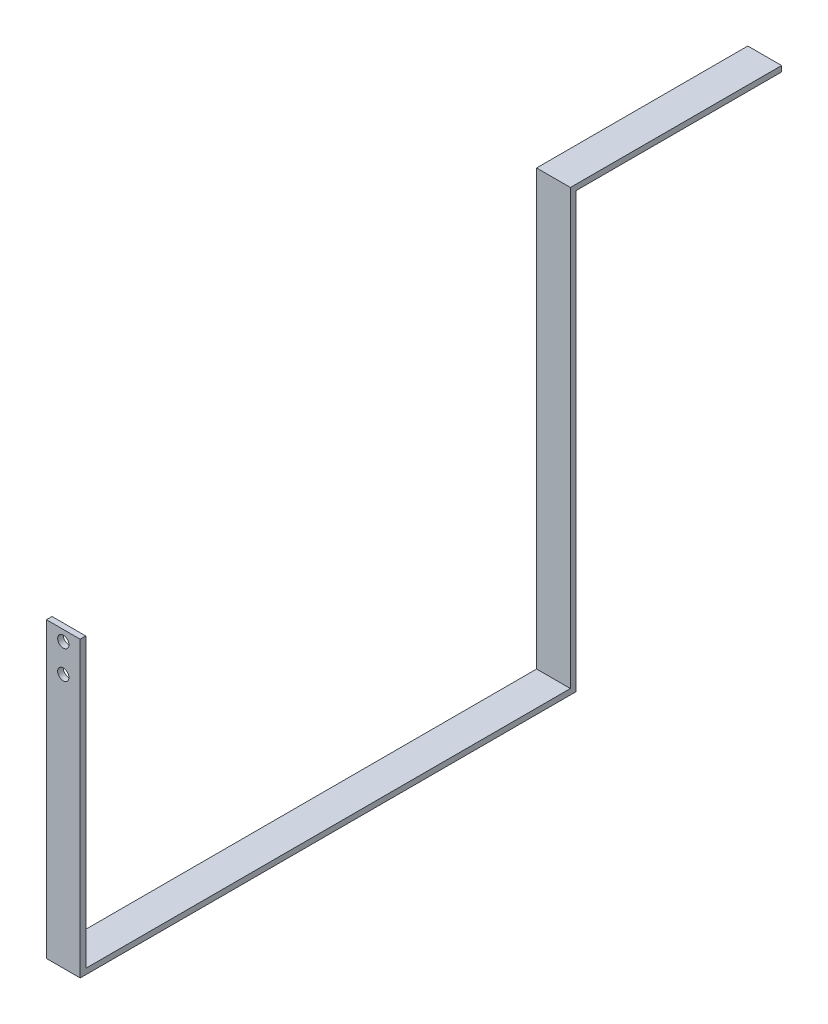
ISO-10303-21;
HEADER;
FILE_DESCRIPTION(('STEP AP214'),'2;1');
FILE_NAME('part.step','',(''),(''),'','','');
FILE_SCHEMA(('AUTOMOTIVE_DESIGN { 1 0 10303 214 1 1 1 1 }'));
ENDSEC;
DATA;
#1=APPLICATION_CONTEXT('core data for automotive mechanical design processes');
#2=APPLICATION_PROTOCOL_DEFINITION('international standard','automotive_design',2000,#1);
#3=PRODUCT_CONTEXT('',#1,'mechanical');
#4=PRODUCT('Part','Part','',(#3));
#5=PRODUCT_RELATED_PRODUCT_CATEGORY('part','',(#4));
#6=PRODUCT_DEFINITION_FORMATION('','',#4);
#7=PRODUCT_DEFINITION_CONTEXT('part definition',#1,'design');
#8=PRODUCT_DEFINITION('design','',#6,#7);
#9=PRODUCT_DEFINITION_SHAPE('','',#8);
#10=(LENGTH_UNIT() NAMED_UNIT(*) SI_UNIT(.MILLI.,.METRE.));
#11=(NAMED_UNIT(*) PLANE_ANGLE_UNIT() SI_UNIT($,.RADIAN.));
#12=(NAMED_UNIT(*) SI_UNIT($,.STERADIAN.) SOLID_ANGLE_UNIT());
#13=UNCERTAINTY_MEASURE_WITH_UNIT(LENGTH_MEASURE(1.E-05),#10,'distance_accuracy_value','');
#14=(GEOMETRIC_REPRESENTATION_CONTEXT(3) GLOBAL_UNCERTAINTY_ASSIGNED_CONTEXT((#13)) GLOBAL_UNIT_ASSIGNED_CONTEXT((#10,
#11,#12)) REPRESENTATION_CONTEXT('',''));
#15=CARTESIAN_POINT('',(0.,0.,0.));
#16=DIRECTION('',(0.,0.,1.));
#17=DIRECTION('',(1.,0.,0.));
#18=AXIS2_PLACEMENT_3D('',#15,#16,#17);
#19=CARTESIAN_POINT('',(19.05,-485.945,790.56));
#20=DIRECTION('',(0.,-1.,0.));
#21=DIRECTION('',(1.,0.,0.));
#22=AXIS2_PLACEMENT_3D('',#19,#20,#21);
#23=PLANE('',#22);
#24=DIRECTION('',(-1.,0.,0.));
#25=VECTOR('',#24,1.);
#26=CARTESIAN_POINT('',(-19.05,-485.945,784.25));
#27=LINE('',#26,#25);
#28=CARTESIAN_POINT('',(19.05,-485.945,784.25));
#29=VERTEX_POINT('',#28);
#30=CARTESIAN_POINT('',(-19.05,-485.945,784.25));
#31=VERTEX_POINT('',#30);
#32=EDGE_CURVE('E134',#29,#31,#27,.T.);
#33=ORIENTED_EDGE('',*,*,#32,.F.);
#34=DIRECTION('',(0.,0.,-1.));
#35=VECTOR('',#34,1.);
#36=CARTESIAN_POINT('',(19.05,-485.945,790.56));
#37=LINE('',#36,#35);
#38=CARTESIAN_POINT('',(19.05,-485.945,238.06));
#39=VERTEX_POINT('',#38);
#40=EDGE_CURVE('E51',#29,#39,#37,.T.);
#41=ORIENTED_EDGE('',*,*,#40,.T.);
#42=DIRECTION('',(-1.,0.,0.));
#43=VECTOR('',#42,1.);
#44=CARTESIAN_POINT('',(19.05,-485.945,238.06));
#45=LINE('',#44,#43);
#46=CARTESIAN_POINT('',(-19.05,-485.945,238.06));
#47=VERTEX_POINT('',#46);
#48=EDGE_CURVE('E138',#39,#47,#45,.T.);
#49=ORIENTED_EDGE('',*,*,#48,.T.);
#50=DIRECTION('',(0.,0.,-1.));
#51=VECTOR('',#50,1.);
#52=CARTESIAN_POINT('',(-19.05,-485.945,790.56));
#53=LINE('',#52,#51);
#54=EDGE_CURVE('E151',#31,#47,#53,.T.);
#55=ORIENTED_EDGE('',*,*,#54,.F.);
#56=EDGE_LOOP('',(#33,#41,#49,#55));
#57=FACE_BOUND('',#56,.T.);
#58=ADVANCED_FACE('F36',(#57),#23,.F.);
#59=CARTESIAN_POINT('',(0.,0.,238.06));
#60=DIRECTION('',(0.,0.,-1.));
#61=DIRECTION('',(-1.,0.,0.));
#62=AXIS2_PLACEMENT_3D('',#59,#60,#61);
#63=PLANE('',#62);
#64=ORIENTED_EDGE('',*,*,#48,.F.);
#65=DIRECTION('',(0.,1.,0.));
#66=VECTOR('',#65,1.);
#67=CARTESIAN_POINT('',(19.05,-3.155,238.06));
#68=LINE('',#67,#66);
#69=CARTESIAN_POINT('',(19.05,3.155,238.06));
#70=VERTEX_POINT('',#69);
#71=EDGE_CURVE('E169',#39,#70,#68,.T.);
#72=ORIENTED_EDGE('',*,*,#71,.T.);
#73=DIRECTION('',(-1.,0.,0.));
#74=VECTOR('',#73,1.);
#75=CARTESIAN_POINT('',(-19.05,3.155,238.06));
#76=LINE('',#75,#74);
#77=CARTESIAN_POINT('',(-19.05,3.155,238.06));
#78=VERTEX_POINT('',#77);
#79=EDGE_CURVE('E171',#70,#78,#76,.T.);
#80=ORIENTED_EDGE('',*,*,#79,.T.);
#81=DIRECTION('',(0.,-1.,0.));
#82=VECTOR('',#81,1.);
#83=CARTESIAN_POINT('',(-19.05,-3.155,238.06));
#84=LINE('',#83,#82);
#85=EDGE_CURVE('E174',#78,#47,#84,.T.);
#86=ORIENTED_EDGE('',*,*,#85,.T.);
#87=EDGE_LOOP('',(#64,#72,#80,#86));
#88=FACE_BOUND('',#87,.T.);
#89=ADVANCED_FACE('F251',(#88),#63,.F.);
#90=CARTESIAN_POINT('',(-19.05,-3.155,238.06));
#91=DIRECTION('',(0.,1.,0.));
#92=DIRECTION('',(0.,0.,1.));
#93=AXIS2_PLACEMENT_3D('',#90,#91,#92);
#94=PLANE('',#93);
#95=DIRECTION('',(1.,0.,0.));
#96=VECTOR('',#95,1.);
#97=CARTESIAN_POINT('',(-19.05,-3.155,231.75));
#98=LINE('',#97,#96);
#99=CARTESIAN_POINT('',(-19.05,-3.155,231.75));
#100=VERTEX_POINT('',#99);
#101=CARTESIAN_POINT('',(19.05,-3.155,231.75));
#102=VERTEX_POINT('',#101);
#103=EDGE_CURVE('E59',#100,#102,#98,.T.);
#104=ORIENTED_EDGE('',*,*,#103,.F.);
#105=DIRECTION('',(0.,0.,-1.));
#106=VECTOR('',#105,1.);
#107=CARTESIAN_POINT('',(-19.05,-3.155,238.06));
#108=LINE('',#107,#106);
#109=CARTESIAN_POINT('',(-19.05,-3.155,0.));
#110=VERTEX_POINT('',#109);
#111=EDGE_CURVE('E187',#100,#110,#108,.T.);
#112=ORIENTED_EDGE('',*,*,#111,.T.);
#113=DIRECTION('',(1.,0.,0.));
#114=VECTOR('',#113,1.);
#115=CARTESIAN_POINT('',(-19.05,-3.155,0.));
#116=LINE('',#115,#114);
#117=CARTESIAN_POINT('',(19.05,-3.155,0.));
#118=VERTEX_POINT('',#117);
#119=EDGE_CURVE('E172',#110,#118,#116,.T.);
#120=ORIENTED_EDGE('',*,*,#119,.T.);
#121=DIRECTION('',(0.,0.,-1.));
#122=VECTOR('',#121,1.);
#123=CARTESIAN_POINT('',(19.05,-3.155,238.06));
#124=LINE('',#123,#122);
#125=EDGE_CURVE('E177',#102,#118,#124,.T.);
#126=ORIENTED_EDGE('',*,*,#125,.F.);
#127=EDGE_LOOP('',(#104,#112,#120,#126));
#128=FACE_BOUND('',#127,.T.);
#129=ADVANCED_FACE('F200',(#128),#94,.F.);
#130=CARTESIAN_POINT('',(19.05,-3.155,238.06));
#131=DIRECTION('',(-1.,0.,0.));
#132=DIRECTION('',(0.,0.,1.));
#133=AXIS2_PLACEMENT_3D('',#130,#131,#132);
#134=PLANE('',#133);
#135=DIRECTION('',(0.,1.,0.));
#136=VECTOR('',#135,1.);
#137=CARTESIAN_POINT('',(19.05,-3.155,0.));
#138=LINE('',#137,#136);
#139=CARTESIAN_POINT('',(19.05,3.155,0.));
#140=VERTEX_POINT('',#139);
#141=EDGE_CURVE('E168',#118,#140,#138,.T.);
#142=ORIENTED_EDGE('',*,*,#141,.T.);
#143=DIRECTION('',(0.,0.,-1.));
#144=VECTOR('',#143,1.);
#145=CARTESIAN_POINT('',(19.05,3.155,238.06));
#146=LINE('',#145,#144);
#147=EDGE_CURVE('E11',#70,#140,#146,.T.);
#148=ORIENTED_EDGE('',*,*,#147,.F.);
#149=ORIENTED_EDGE('',*,*,#71,.F.);
#150=ORIENTED_EDGE('',*,*,#40,.F.);
#151=DIRECTION('',(0.,-1.,0.));
#152=VECTOR('',#151,1.);
#153=CARTESIAN_POINT('',(19.05,-161.555,784.25));
#154=LINE('',#153,#152);
#155=CARTESIAN_POINT('',(19.05,-161.555,784.25));
#156=VERTEX_POINT('',#155);
#157=EDGE_CURVE('E118',#156,#29,#154,.T.);
#158=ORIENTED_EDGE('',*,*,#157,.F.);
#159=DIRECTION('',(0.,0.,-1.));
#160=VECTOR('',#159,1.);
#161=CARTESIAN_POINT('',(19.05,-161.555,784.25));
#162=LINE('',#161,#160);
#163=CARTESIAN_POINT('',(19.05,-161.555,790.56));
#164=VERTEX_POINT('',#163);
#165=EDGE_CURVE('E125',#164,#156,#162,.T.);
#166=ORIENTED_EDGE('',*,*,#165,.F.);
#167=DIRECTION('',(0.,1.,0.));
#168=VECTOR('',#167,1.);
#169=CARTESIAN_POINT('',(19.05,-492.255,790.56));
#170=LINE('',#169,#168);
#171=CARTESIAN_POINT('',(19.05,-492.255,790.56));
#172=VERTEX_POINT('',#171);
#173=EDGE_CURVE('E150',#172,#164,#170,.T.);
#174=ORIENTED_EDGE('',*,*,#173,.F.);
#175=DIRECTION('',(0.,0.,1.));
#176=VECTOR('',#175,1.);
#177=CARTESIAN_POINT('',(19.05,-492.255,231.75));
#178=LINE('',#177,#176);
#179=CARTESIAN_POINT('',(19.05,-492.255,231.75));
#180=VERTEX_POINT('',#179);
#181=EDGE_CURVE('E155',#180,#172,#178,.T.);
#182=ORIENTED_EDGE('',*,*,#181,.F.);
#183=DIRECTION('',(0.,1.,0.));
#184=VECTOR('',#183,1.);
#185=CARTESIAN_POINT('',(19.05,-492.255,231.75));
#186=LINE('',#185,#184);
#187=EDGE_CURVE('E161',#180,#102,#186,.T.);
#188=ORIENTED_EDGE('',*,*,#187,.T.);
#189=ORIENTED_EDGE('',*,*,#125,.T.);
#190=EDGE_LOOP('',(#142,#148,#149,#150,#158,#166,#174,#182,#188,#189));
#191=FACE_BOUND('',#190,.T.);
#192=ADVANCED_FACE('F38',(#191),#134,.F.);
#193=CARTESIAN_POINT('',(-19.05,3.155,238.06));
#194=DIRECTION('',(0.,-1.,0.));
#195=DIRECTION('',(0.,0.,-1.));
#196=AXIS2_PLACEMENT_3D('',#193,#194,#195);
#197=PLANE('',#196);
#198=DIRECTION('',(-1.,0.,0.));
#199=VECTOR('',#198,1.);
#200=CARTESIAN_POINT('',(-19.05,3.155,0.));
#201=LINE('',#200,#199);
#202=CARTESIAN_POINT('',(-19.05,3.155,0.));
#203=VERTEX_POINT('',#202);
#204=EDGE_CURVE('E179',#140,#203,#201,.T.);
#205=ORIENTED_EDGE('',*,*,#204,.T.);
#206=DIRECTION('',(0.,0.,-1.));
#207=VECTOR('',#206,1.);
#208=CARTESIAN_POINT('',(-19.05,3.155,238.06));
#209=LINE('',#208,#207);
#210=EDGE_CURVE('E44',#78,#203,#209,.T.);
#211=ORIENTED_EDGE('',*,*,#210,.F.);
#212=ORIENTED_EDGE('',*,*,#79,.F.);
#213=ORIENTED_EDGE('',*,*,#147,.T.);
#214=EDGE_LOOP('',(#205,#211,#212,#213));
#215=FACE_BOUND('',#214,.T.);
#216=ADVANCED_FACE('F269',(#215),#197,.F.);
#217=CARTESIAN_POINT('',(-19.05,-3.155,238.06));
#218=DIRECTION('',(1.,0.,0.));
#219=DIRECTION('',(0.,0.,-1.));
#220=AXIS2_PLACEMENT_3D('',#217,#218,#219);
#221=PLANE('',#220);
#222=DIRECTION('',(0.,-1.,0.));
#223=VECTOR('',#222,1.);
#224=CARTESIAN_POINT('',(-19.05,-3.155,0.));
#225=LINE('',#224,#223);
#226=EDGE_CURVE('E181',#203,#110,#225,.T.);
#227=ORIENTED_EDGE('',*,*,#226,.T.);
#228=ORIENTED_EDGE('',*,*,#111,.F.);
#229=DIRECTION('',(0.,1.,0.));
#230=VECTOR('',#229,1.);
#231=CARTESIAN_POINT('',(-19.05,-492.255,231.75));
#232=LINE('',#231,#230);
#233=CARTESIAN_POINT('',(-19.05,-492.255,231.75));
#234=VERTEX_POINT('',#233);
#235=EDGE_CURVE('E165',#234,#100,#232,.T.);
#236=ORIENTED_EDGE('',*,*,#235,.F.);
#237=DIRECTION('',(0.,0.,-1.));
#238=VECTOR('',#237,1.);
#239=CARTESIAN_POINT('',(-19.05,-492.255,238.06));
#240=LINE('',#239,#238);
#241=CARTESIAN_POINT('',(-19.05,-492.255,790.56));
#242=VERTEX_POINT('',#241);
#243=EDGE_CURVE('E157',#242,#234,#240,.T.);
#244=ORIENTED_EDGE('',*,*,#243,.F.);
#245=DIRECTION('',(0.,-1.,0.));
#246=VECTOR('',#245,1.);
#247=CARTESIAN_POINT('',(-19.05,-485.945,790.56));
#248=LINE('',#247,#246);
#249=CARTESIAN_POINT('',(-19.05,-161.555,790.56));
#250=VERTEX_POINT('',#249);
#251=EDGE_CURVE('E140',#250,#242,#248,.T.);
#252=ORIENTED_EDGE('',*,*,#251,.F.);
#253=DIRECTION('',(0.,0.,1.));
#254=VECTOR('',#253,1.);
#255=CARTESIAN_POINT('',(-19.05,-161.555,790.56));
#256=LINE('',#255,#254);
#257=CARTESIAN_POINT('',(-19.05,-161.555,784.25));
#258=VERTEX_POINT('',#257);
#259=EDGE_CURVE('E124',#258,#250,#256,.T.);
#260=ORIENTED_EDGE('',*,*,#259,.F.);
#261=DIRECTION('',(0.,-1.,0.));
#262=VECTOR('',#261,1.);
#263=CARTESIAN_POINT('',(-19.05,-161.555,784.25));
#264=LINE('',#263,#262);
#265=EDGE_CURVE('E120',#258,#31,#264,.T.);
#266=ORIENTED_EDGE('',*,*,#265,.T.);
#267=ORIENTED_EDGE('',*,*,#54,.T.);
#268=ORIENTED_EDGE('',*,*,#85,.F.);
#269=ORIENTED_EDGE('',*,*,#210,.T.);
#270=EDGE_LOOP('',(#227,#228,#236,#244,#252,#260,#266,#267,#268,#269));
#271=FACE_BOUND('',#270,.T.);
#272=ADVANCED_FACE('F193',(#271),#221,.F.);
#273=CARTESIAN_POINT('',(0.,0.,0.));
#274=DIRECTION('',(0.,0.,-1.));
#275=DIRECTION('',(-1.,0.,0.));
#276=AXIS2_PLACEMENT_3D('',#273,#274,#275);
#277=PLANE('',#276);
#278=ORIENTED_EDGE('',*,*,#141,.F.);
#279=ORIENTED_EDGE('',*,*,#119,.F.);
#280=ORIENTED_EDGE('',*,*,#226,.F.);
#281=ORIENTED_EDGE('',*,*,#204,.F.);
#282=EDGE_LOOP('',(#278,#279,#280,#281));
#283=FACE_BOUND('',#282,.T.);
#284=ADVANCED_FACE('F199',(#283),#277,.T.);
#285=CARTESIAN_POINT('',(-19.05,-492.255,231.75));
#286=DIRECTION('',(0.,0.,1.));
#287=DIRECTION('',(1.,0.,0.));
#288=AXIS2_PLACEMENT_3D('',#285,#286,#287);
#289=PLANE('',#288);
#290=ORIENTED_EDGE('',*,*,#103,.T.);
#291=ORIENTED_EDGE('',*,*,#187,.F.);
#292=DIRECTION('',(1.,0.,0.));
#293=VECTOR('',#292,1.);
#294=CARTESIAN_POINT('',(-19.05,-492.255,231.75));
#295=LINE('',#294,#293);
#296=EDGE_CURVE('E159',#234,#180,#295,.T.);
#297=ORIENTED_EDGE('',*,*,#296,.F.);
#298=ORIENTED_EDGE('',*,*,#235,.T.);
#299=EDGE_LOOP('',(#290,#291,#297,#298));
#300=FACE_BOUND('',#299,.T.);
#301=ADVANCED_FACE('F204',(#300),#289,.F.);
#302=CARTESIAN_POINT('',(0.,-492.255,0.));
#303=DIRECTION('',(0.,-1.,0.));
#304=DIRECTION('',(0.,0.,-1.));
#305=AXIS2_PLACEMENT_3D('',#302,#303,#304);
#306=PLANE('',#305);
#307=ORIENTED_EDGE('',*,*,#181,.T.);
#308=DIRECTION('',(1.,0.,0.));
#309=VECTOR('',#308,1.);
#310=CARTESIAN_POINT('',(-19.05,-492.255,790.56));
#311=LINE('',#310,#309);
#312=EDGE_CURVE('E147',#242,#172,#311,.T.);
#313=ORIENTED_EDGE('',*,*,#312,.F.);
#314=ORIENTED_EDGE('',*,*,#243,.T.);
#315=ORIENTED_EDGE('',*,*,#296,.T.);
#316=EDGE_LOOP('',(#307,#313,#314,#315));
#317=FACE_BOUND('',#316,.T.);
#318=ADVANCED_FACE('F208',(#317),#306,.T.);
#319=CARTESIAN_POINT('',(0.,0.,790.56));
#320=DIRECTION('',(0.,0.,1.));
#321=DIRECTION('',(1.,0.,0.));
#322=AXIS2_PLACEMENT_3D('',#319,#320,#321);
#323=PLANE('',#322);
#324=CARTESIAN_POINT('',(-1.94289029309402E-13,-205.447204665716,790.56));
#325=DIRECTION('',(0.,0.,1.));
#326=DIRECTION('',(1.,0.,0.));
#327=AXIS2_PLACEMENT_3D('',#324,#325,#326);
#328=CIRCLE('',#327,6.34999999999994);
#329=CARTESIAN_POINT('',(6.34999999999975,-205.447204665716,790.56));
#330=VERTEX_POINT('',#329);
#331=EDGE_CURVE('E224',#330,#330,#328,.T.);
#332=ORIENTED_EDGE('',*,*,#331,.F.);
#333=EDGE_LOOP('',(#332));
#334=FACE_BOUND('',#333,.T.);
#335=CARTESIAN_POINT('',(0.,-173.447204665716,790.56));
#336=DIRECTION('',(0.,0.,1.));
#337=DIRECTION('',(1.,0.,0.));
#338=AXIS2_PLACEMENT_3D('',#335,#336,#337);
#339=CIRCLE('',#338,6.34999999999999);
#340=CARTESIAN_POINT('',(6.34999999999991,-173.447204665716,790.56));
#341=VERTEX_POINT('',#340);
#342=EDGE_CURVE('E216',#341,#341,#339,.T.);
#343=ORIENTED_EDGE('',*,*,#342,.F.);
#344=EDGE_LOOP('',(#343));
#345=FACE_BOUND('',#344,.T.);
#346=ORIENTED_EDGE('',*,*,#251,.T.);
#347=ORIENTED_EDGE('',*,*,#312,.T.);
#348=ORIENTED_EDGE('',*,*,#173,.T.);
#349=DIRECTION('',(1.,0.,0.));
#350=VECTOR('',#349,1.);
#351=CARTESIAN_POINT('',(19.05,-161.555,790.56));
#352=LINE('',#351,#350);
#353=EDGE_CURVE('E131',#250,#164,#352,.T.);
#354=ORIENTED_EDGE('',*,*,#353,.F.);
#355=EDGE_LOOP('',(#346,#347,#348,#354));
#356=FACE_BOUND('',#355,.T.);
#357=ADVANCED_FACE('F212',(#334,#345,#356),#323,.T.);
#358=CARTESIAN_POINT('',(-19.05,-161.555,784.25));
#359=DIRECTION('',(0.,0.,1.));
#360=DIRECTION('',(1.,0.,0.));
#361=AXIS2_PLACEMENT_3D('',#358,#359,#360);
#362=PLANE('',#361);
#363=CARTESIAN_POINT('',(-1.94289029309402E-13,-205.447204665716,784.25));
#364=DIRECTION('',(0.,0.,1.));
#365=DIRECTION('',(1.,0.,0.));
#366=AXIS2_PLACEMENT_3D('',#363,#364,#365);
#367=CIRCLE('',#366,6.34999999999994);
#368=CARTESIAN_POINT('',(6.34999999999975,-205.447204665716,784.25));
#369=VERTEX_POINT('',#368);
#370=EDGE_CURVE('E221',#369,#369,#367,.T.);
#371=ORIENTED_EDGE('',*,*,#370,.T.);
#372=EDGE_LOOP('',(#371));
#373=FACE_BOUND('',#372,.T.);
#374=CARTESIAN_POINT('',(0.,-173.447204665716,784.25));
#375=DIRECTION('',(0.,0.,1.));
#376=DIRECTION('',(1.,0.,0.));
#377=AXIS2_PLACEMENT_3D('',#374,#375,#376);
#378=CIRCLE('',#377,6.34999999999999);
#379=CARTESIAN_POINT('',(6.34999999999991,-173.447204665716,784.25));
#380=VERTEX_POINT('',#379);
#381=EDGE_CURVE('E214',#380,#380,#378,.T.);
#382=ORIENTED_EDGE('',*,*,#381,.T.);
#383=EDGE_LOOP('',(#382));
#384=FACE_BOUND('',#383,.T.);
#385=ORIENTED_EDGE('',*,*,#32,.T.);
#386=ORIENTED_EDGE('',*,*,#265,.F.);
#387=DIRECTION('',(-1.,0.,0.));
#388=VECTOR('',#387,1.);
#389=CARTESIAN_POINT('',(-19.05,-161.555,784.25));
#390=LINE('',#389,#388);
#391=EDGE_CURVE('E114',#156,#258,#390,.T.);
#392=ORIENTED_EDGE('',*,*,#391,.F.);
#393=ORIENTED_EDGE('',*,*,#157,.T.);
#394=EDGE_LOOP('',(#385,#386,#392,#393));
#395=FACE_BOUND('',#394,.T.);
#396=ADVANCED_FACE('F116',(#373,#384,#395),#362,.F.);
#397=CARTESIAN_POINT('',(0.,-161.555,0.));
#398=DIRECTION('',(0.,-1.,0.));
#399=DIRECTION('',(0.,0.,-1.));
#400=AXIS2_PLACEMENT_3D('',#397,#398,#399);
#401=PLANE('',#400);
#402=ORIENTED_EDGE('',*,*,#165,.T.);
#403=ORIENTED_EDGE('',*,*,#391,.T.);
#404=ORIENTED_EDGE('',*,*,#259,.T.);
#405=ORIENTED_EDGE('',*,*,#353,.T.);
#406=EDGE_LOOP('',(#402,#403,#404,#405));
#407=FACE_BOUND('',#406,.T.);
#408=ADVANCED_FACE('F129',(#407),#401,.F.);
#409=CARTESIAN_POINT('',(0.,-173.447204665716,784.25));
#410=DIRECTION('',(0.,0.,1.));
#411=DIRECTION('',(1.,0.,0.));
#412=AXIS2_PLACEMENT_3D('',#409,#410,#411);
#413=CYLINDRICAL_SURFACE('',#412,6.34999999999999);
#414=ORIENTED_EDGE('',*,*,#381,.F.);
#415=EDGE_LOOP('',(#414));
#416=FACE_BOUND('',#415,.T.);
#417=ORIENTED_EDGE('',*,*,#342,.T.);
#418=EDGE_LOOP('',(#417));
#419=FACE_BOUND('',#418,.T.);
#420=ADVANCED_FACE('F234',(#416,#419),#413,.F.);
#421=CARTESIAN_POINT('',(-1.94289029309402E-13,-205.447204665716,784.25));
#422=DIRECTION('',(0.,0.,1.));
#423=DIRECTION('',(1.,0.,0.));
#424=AXIS2_PLACEMENT_3D('',#421,#422,#423);
#425=CYLINDRICAL_SURFACE('',#424,6.34999999999994);
#426=ORIENTED_EDGE('',*,*,#370,.F.);
#427=EDGE_LOOP('',(#426));
#428=FACE_BOUND('',#427,.T.);
#429=ORIENTED_EDGE('',*,*,#331,.T.);
#430=EDGE_LOOP('',(#429));
#431=FACE_BOUND('',#430,.T.);
#432=ADVANCED_FACE('F231',(#428,#431),#425,.F.);
#433=CLOSED_SHELL('',(#58,#89,#129,#192,#216,#272,#284,#301,#318,#357,#396,#408,#420,#432));
#434=MANIFOLD_SOLID_BREP('B2',#433);
#435=ADVANCED_BREP_SHAPE_REPRESENTATION('',(#18,#434),#14);
#436=SHAPE_DEFINITION_REPRESENTATION(#9,#435);
ENDSEC;
END-ISO-10303-21;
